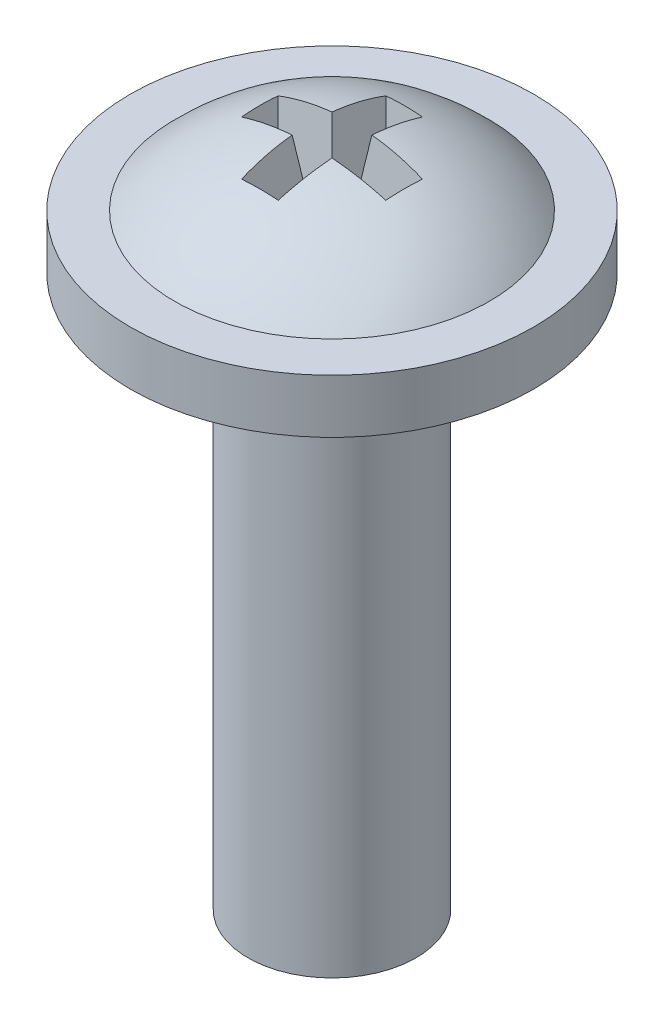
ISO-10303-21;
HEADER;
FILE_DESCRIPTION(('STEP AP214'),'2;1');
FILE_NAME('part.step','',(''),(''),'','','');
FILE_SCHEMA(('AUTOMOTIVE_DESIGN { 1 0 10303 214 1 1 1 1 }'));
ENDSEC;
DATA;
#1=APPLICATION_CONTEXT('core data for automotive mechanical design processes');
#2=APPLICATION_PROTOCOL_DEFINITION('international standard','automotive_design',2000,#1);
#3=PRODUCT_CONTEXT('',#1,'mechanical');
#4=PRODUCT('Part','Part','',(#3));
#5=PRODUCT_RELATED_PRODUCT_CATEGORY('part','',(#4));
#6=PRODUCT_DEFINITION_FORMATION('','',#4);
#7=PRODUCT_DEFINITION_CONTEXT('part definition',#1,'design');
#8=PRODUCT_DEFINITION('design','',#6,#7);
#9=PRODUCT_DEFINITION_SHAPE('','',#8);
#10=(LENGTH_UNIT() NAMED_UNIT(*) SI_UNIT(.MILLI.,.METRE.));
#11=(NAMED_UNIT(*) PLANE_ANGLE_UNIT() SI_UNIT($,.RADIAN.));
#12=(NAMED_UNIT(*) SI_UNIT($,.STERADIAN.) SOLID_ANGLE_UNIT());
#13=UNCERTAINTY_MEASURE_WITH_UNIT(LENGTH_MEASURE(1.E-05),#10,'distance_accuracy_value','');
#14=(GEOMETRIC_REPRESENTATION_CONTEXT(3) GLOBAL_UNCERTAINTY_ASSIGNED_CONTEXT((#13)) GLOBAL_UNIT_ASSIGNED_CONTEXT((#10,
#11,#12)) REPRESENTATION_CONTEXT('',''));
#15=CARTESIAN_POINT('',(0.,0.,0.));
#16=DIRECTION('',(0.,0.,1.));
#17=DIRECTION('',(1.,0.,0.));
#18=AXIS2_PLACEMENT_3D('',#15,#16,#17);
#19=CARTESIAN_POINT('',(0.,8.587994,0.));
#20=DIRECTION('',(0.,-1.,0.));
#21=DIRECTION('',(1.,0.,0.));
#22=AXIS2_PLACEMENT_3D('',#19,#20,#21);
#23=SPHERICAL_SURFACE('',#22,4.112006);
#24=CARTESIAN_POINT('',(0.,11.43,0.));
#25=DIRECTION('',(0.,-1.,0.));
#26=DIRECTION('',(0.,0.,-1.));
#27=AXIS2_PLACEMENT_3D('',#24,#25,#26);
#28=CIRCLE('',#27,2.9718);
#29=CARTESIAN_POINT('',(0.,11.43,-2.9718));
#30=VERTEX_POINT('',#29);
#31=EDGE_CURVE('E144',#30,#30,#28,.T.);
#32=ORIENTED_EDGE('',*,*,#31,.F.);
#33=EDGE_LOOP('',(#32));
#34=FACE_BOUND('',#33,.T.);
#35=CARTESIAN_POINT('',(0.,8.47510737632755,0.803230064141093));
#36=DIRECTION('',(0.,-0.139173100960066,0.99026806874157));
#37=DIRECTION('',(0.,-0.99026806874157,-0.139173100960066));
#38=AXIS2_PLACEMENT_3D('',#35,#36,#37);
#39=CIRCLE('',#38,4.03121215247867);
#40=CARTESIAN_POINT('',(-0.346193686486263,12.4523402106765,1.36219368648626));
#41=VERTEX_POINT('',#40);
#42=CARTESIAN_POINT('',(0.346193686486263,12.4523402106765,1.36219368648626));
#43=VERTEX_POINT('',#42);
#44=EDGE_CURVE('E190',#41,#43,#39,.F.);
#45=ORIENTED_EDGE('',*,*,#44,.F.);
#46=CARTESIAN_POINT('',(0.193090877395566,8.61513115308259,0.));
#47=DIRECTION('',(-0.99026806874157,-0.139173100960066,0.));
#48=DIRECTION('',(0.139173100960066,-0.99026806874157,0.));
#49=AXIS2_PLACEMENT_3D('',#46,#47,#48);
#50=CIRCLE('',#49,4.10738028821598);
#51=CARTESIAN_POINT('',(-0.376143924808765,12.6654472296146,0.376143924808762));
#52=VERTEX_POINT('',#51);
#53=EDGE_CURVE('E11',#41,#52,#50,.T.);
#54=ORIENTED_EDGE('',*,*,#53,.T.);
#55=CARTESIAN_POINT('',(0.,8.61513115308259,-0.19309087739557));
#56=DIRECTION('',(0.,-0.139173100960066,0.99026806874157));
#57=DIRECTION('',(0.,-0.99026806874157,-0.139173100960066));
#58=AXIS2_PLACEMENT_3D('',#55,#56,#57);
#59=CIRCLE('',#58,4.10738028821598);
#60=CARTESIAN_POINT('',(-1.36219368648626,12.4523402106765,0.34619368648626));
#61=VERTEX_POINT('',#60);
#62=EDGE_CURVE('E53',#61,#52,#59,.F.);
#63=ORIENTED_EDGE('',*,*,#62,.F.);
#64=CARTESIAN_POINT('',(-0.803230064141096,8.47510737632755,0.));
#65=DIRECTION('',(-0.99026806874157,-0.139173100960066,0.));
#66=DIRECTION('',(0.139173100960066,-0.99026806874157,0.));
#67=AXIS2_PLACEMENT_3D('',#64,#65,#66);
#68=CIRCLE('',#67,4.03121215247867);
#69=CARTESIAN_POINT('',(-1.36219368648626,12.4523402106765,-0.34619368648626));
#70=VERTEX_POINT('',#69);
#71=EDGE_CURVE('E212',#61,#70,#68,.T.);
#72=ORIENTED_EDGE('',*,*,#71,.T.);
#73=CARTESIAN_POINT('',(0.,8.61513115308259,0.193090877395571));
#74=DIRECTION('',(0.,-0.139173100960066,-0.99026806874157));
#75=DIRECTION('',(0.,0.99026806874157,-0.139173100960066));
#76=AXIS2_PLACEMENT_3D('',#73,#74,#75);
#77=CIRCLE('',#76,4.10738028821598);
#78=CARTESIAN_POINT('',(-0.376143924808767,12.6654472296146,-0.376143924808761));
#79=VERTEX_POINT('',#78);
#80=EDGE_CURVE('E210',#79,#70,#77,.F.);
#81=ORIENTED_EDGE('',*,*,#80,.F.);
#82=CARTESIAN_POINT('',(0.193090877395564,8.61513115308259,0.));
#83=DIRECTION('',(-0.99026806874157,-0.139173100960066,0.));
#84=DIRECTION('',(0.139173100960066,-0.99026806874157,0.));
#85=AXIS2_PLACEMENT_3D('',#82,#83,#84);
#86=CIRCLE('',#85,4.10738028821598);
#87=CARTESIAN_POINT('',(-0.346193686486261,12.4523402106765,-1.36219368648626));
#88=VERTEX_POINT('',#87);
#89=EDGE_CURVE('E207',#79,#88,#86,.T.);
#90=ORIENTED_EDGE('',*,*,#89,.T.);
#91=CARTESIAN_POINT('',(0.,8.47510737632755,-0.803230064141093));
#92=DIRECTION('',(0.,-0.139173100960066,-0.99026806874157));
#93=DIRECTION('',(0.,0.99026806874157,-0.139173100960066));
#94=AXIS2_PLACEMENT_3D('',#91,#92,#93);
#95=CIRCLE('',#94,4.03121215247867);
#96=CARTESIAN_POINT('',(0.346193686486262,12.4523402106765,-1.36219368648626));
#97=VERTEX_POINT('',#96);
#98=EDGE_CURVE('E205',#97,#88,#95,.F.);
#99=ORIENTED_EDGE('',*,*,#98,.F.);
#100=CARTESIAN_POINT('',(-0.193090877395566,8.61513115308259,0.));
#101=DIRECTION('',(0.99026806874157,-0.139173100960066,0.));
#102=DIRECTION('',(0.139173100960066,0.99026806874157,0.));
#103=AXIS2_PLACEMENT_3D('',#100,#101,#102);
#104=CIRCLE('',#103,4.10738028821598);
#105=CARTESIAN_POINT('',(0.376143924808765,12.6654472296146,-0.376143924808762));
#106=VERTEX_POINT('',#105);
#107=EDGE_CURVE('E202',#97,#106,#104,.T.);
#108=ORIENTED_EDGE('',*,*,#107,.T.);
#109=CARTESIAN_POINT('',(0.,8.61513115308259,0.19309087739557));
#110=DIRECTION('',(0.,-0.139173100960066,-0.99026806874157));
#111=DIRECTION('',(0.,0.99026806874157,-0.139173100960066));
#112=AXIS2_PLACEMENT_3D('',#109,#110,#111);
#113=CIRCLE('',#112,4.10738028821598);
#114=CARTESIAN_POINT('',(1.36219368648626,12.4523402106765,-0.34619368648626));
#115=VERTEX_POINT('',#114);
#116=EDGE_CURVE('E200',#115,#106,#113,.F.);
#117=ORIENTED_EDGE('',*,*,#116,.F.);
#118=CARTESIAN_POINT('',(0.803230064141096,8.47510737632755,0.));
#119=DIRECTION('',(0.99026806874157,-0.139173100960066,0.));
#120=DIRECTION('',(0.139173100960066,0.99026806874157,0.));
#121=AXIS2_PLACEMENT_3D('',#118,#119,#120);
#122=CIRCLE('',#121,4.03121215247867);
#123=CARTESIAN_POINT('',(1.36219368648626,12.4523402106765,0.346193686486261));
#124=VERTEX_POINT('',#123);
#125=EDGE_CURVE('E197',#115,#124,#122,.T.);
#126=ORIENTED_EDGE('',*,*,#125,.T.);
#127=CARTESIAN_POINT('',(0.,8.61513115308259,-0.193090877395571));
#128=DIRECTION('',(0.,-0.139173100960066,0.99026806874157));
#129=DIRECTION('',(0.,-0.99026806874157,-0.139173100960066));
#130=AXIS2_PLACEMENT_3D('',#127,#128,#129);
#131=CIRCLE('',#130,4.10738028821598);
#132=CARTESIAN_POINT('',(0.376143924808765,12.6654472296146,0.376143924808762));
#133=VERTEX_POINT('',#132);
#134=EDGE_CURVE('E195',#133,#124,#131,.F.);
#135=ORIENTED_EDGE('',*,*,#134,.F.);
#136=CARTESIAN_POINT('',(-0.193090877395567,8.61513115308259,0.));
#137=DIRECTION('',(0.99026806874157,-0.139173100960066,0.));
#138=DIRECTION('',(0.139173100960066,0.99026806874157,0.));
#139=AXIS2_PLACEMENT_3D('',#136,#137,#138);
#140=CIRCLE('',#139,4.10738028821598);
#141=EDGE_CURVE('E192',#133,#43,#140,.T.);
#142=ORIENTED_EDGE('',*,*,#141,.T.);
#143=EDGE_LOOP('',(#45,#54,#63,#72,#81,#90,#99,#108,#117,#126,#135,#142));
#144=FACE_BOUND('',#143,.T.);
#145=ADVANCED_FACE('F45',(#34,#144),#23,.T.);
#146=CARTESIAN_POINT('',(0.,0.,0.));
#147=DIRECTION('',(0.,-1.,0.));
#148=DIRECTION('',(0.,0.,-1.));
#149=AXIS2_PLACEMENT_3D('',#146,#147,#148);
#150=PLANE('',#149);
#151=CARTESIAN_POINT('',(0.,0.,0.));
#152=DIRECTION('',(0.,-1.,0.));
#153=DIRECTION('',(0.,0.,-1.));
#154=AXIS2_PLACEMENT_3D('',#151,#152,#153);
#155=CIRCLE('',#154,1.5875);
#156=CARTESIAN_POINT('',(0.,0.,-1.5875));
#157=VERTEX_POINT('',#156);
#158=EDGE_CURVE('E187',#157,#157,#155,.T.);
#159=ORIENTED_EDGE('',*,*,#158,.T.);
#160=EDGE_LOOP('',(#159));
#161=FACE_BOUND('',#160,.T.);
#162=ADVANCED_FACE('F47',(#161),#150,.T.);
#163=CARTESIAN_POINT('',(0.,0.,0.));
#164=DIRECTION('',(0.,-1.,0.));
#165=DIRECTION('',(0.,0.,-1.));
#166=AXIS2_PLACEMENT_3D('',#163,#164,#165);
#167=CYLINDRICAL_SURFACE('',#166,1.5875);
#168=CARTESIAN_POINT('',(0.,10.414,0.));
#169=DIRECTION('',(0.,-1.,0.));
#170=DIRECTION('',(0.,0.,-1.));
#171=AXIS2_PLACEMENT_3D('',#168,#169,#170);
#172=CIRCLE('',#171,1.5875);
#173=CARTESIAN_POINT('',(0.,10.414,-1.5875));
#174=VERTEX_POINT('',#173);
#175=EDGE_CURVE('E184',#174,#174,#172,.T.);
#176=ORIENTED_EDGE('',*,*,#175,.T.);
#177=EDGE_LOOP('',(#176));
#178=FACE_BOUND('',#177,.T.);
#179=ORIENTED_EDGE('',*,*,#158,.F.);
#180=EDGE_LOOP('',(#179));
#181=FACE_BOUND('',#180,.T.);
#182=ADVANCED_FACE('F293',(#178,#181),#167,.T.);
#183=CARTESIAN_POINT('',(1.5875,10.414,0.));
#184=DIRECTION('',(0.,-1.,0.));
#185=DIRECTION('',(0.,0.,-1.));
#186=AXIS2_PLACEMENT_3D('',#183,#184,#185);
#187=PLANE('',#186);
#188=CARTESIAN_POINT('',(0.,10.414,0.));
#189=DIRECTION('',(0.,-1.,0.));
#190=DIRECTION('',(0.,0.,-1.));
#191=AXIS2_PLACEMENT_3D('',#188,#189,#190);
#192=CIRCLE('',#191,3.81);
#193=CARTESIAN_POINT('',(0.,10.414,-3.81));
#194=VERTEX_POINT('',#193);
#195=EDGE_CURVE('E181',#194,#194,#192,.T.);
#196=ORIENTED_EDGE('',*,*,#195,.T.);
#197=EDGE_LOOP('',(#196));
#198=FACE_BOUND('',#197,.T.);
#199=ORIENTED_EDGE('',*,*,#175,.F.);
#200=EDGE_LOOP('',(#199));
#201=FACE_BOUND('',#200,.T.);
#202=ADVANCED_FACE('F305',(#198,#201),#187,.T.);
#203=CARTESIAN_POINT('',(0.,0.,0.));
#204=DIRECTION('',(0.,-1.,0.));
#205=DIRECTION('',(0.,0.,-1.));
#206=AXIS2_PLACEMENT_3D('',#203,#204,#205);
#207=CYLINDRICAL_SURFACE('',#206,3.81);
#208=CARTESIAN_POINT('',(0.,11.43,0.));
#209=DIRECTION('',(0.,-1.,0.));
#210=DIRECTION('',(0.,0.,-1.));
#211=AXIS2_PLACEMENT_3D('',#208,#209,#210);
#212=CIRCLE('',#211,3.81);
#213=CARTESIAN_POINT('',(0.,11.43,-3.81));
#214=VERTEX_POINT('',#213);
#215=EDGE_CURVE('E178',#214,#214,#212,.T.);
#216=ORIENTED_EDGE('',*,*,#215,.T.);
#217=EDGE_LOOP('',(#216));
#218=FACE_BOUND('',#217,.T.);
#219=ORIENTED_EDGE('',*,*,#195,.F.);
#220=EDGE_LOOP('',(#219));
#221=FACE_BOUND('',#220,.T.);
#222=ADVANCED_FACE('F301',(#218,#221),#207,.T.);
#223=CARTESIAN_POINT('',(3.81,11.43,0.));
#224=DIRECTION('',(0.,1.,0.));
#225=DIRECTION('',(0.,0.,1.));
#226=AXIS2_PLACEMENT_3D('',#223,#224,#225);
#227=PLANE('',#226);
#228=ORIENTED_EDGE('',*,*,#31,.T.);
#229=EDGE_LOOP('',(#228));
#230=FACE_BOUND('',#229,.T.);
#231=ORIENTED_EDGE('',*,*,#215,.F.);
#232=EDGE_LOOP('',(#231));
#233=FACE_BOUND('',#232,.T.);
#234=ADVANCED_FACE('F298',(#230,#233),#227,.T.);
#235=CARTESIAN_POINT('',(-0.381000000000002,12.7,1.397));
#236=DIRECTION('',(-0.99026806874157,-0.139173100960066,0.));
#237=DIRECTION('',(0.139173100960066,-0.99026806874157,0.));
#238=AXIS2_PLACEMENT_3D('',#235,#236,#237);
#239=PLANE('',#238);
#240=DIRECTION('',(0.137844537491629,-0.980814848463989,-0.137844537491629));
#241=VECTOR('',#240,1.);
#242=CARTESIAN_POINT('',(-0.381000000000002,12.7,1.397));
#243=LINE('',#242,#241);
#244=CARTESIAN_POINT('',(-0.0954210238847424,10.668,1.11142102388474));
#245=VERTEX_POINT('',#244);
#246=EDGE_CURVE('E60',#245,#41,#243,.F.);
#247=ORIENTED_EDGE('',*,*,#246,.F.);
#248=DIRECTION('',(0.,0.,1.));
#249=VECTOR('',#248,1.);
#250=CARTESIAN_POINT('',(-0.0954210238847421,10.668,1.397));
#251=LINE('',#250,#249);
#252=CARTESIAN_POINT('',(-0.0954210238847434,10.668,0.0954210238847397));
#253=VERTEX_POINT('',#252);
#254=EDGE_CURVE('E134',#245,#253,#251,.F.);
#255=ORIENTED_EDGE('',*,*,#254,.T.);
#256=DIRECTION('',(0.137844537491629,-0.980814848463989,-0.137844537491629));
#257=VECTOR('',#256,1.);
#258=CARTESIAN_POINT('',(-0.400305134380545,12.8373631686579,0.400305134380541));
#259=LINE('',#258,#257);
#260=EDGE_CURVE('E136',#253,#52,#259,.F.);
#261=ORIENTED_EDGE('',*,*,#260,.T.);
#262=ORIENTED_EDGE('',*,*,#53,.F.);
#263=EDGE_LOOP('',(#247,#255,#261,#262));
#264=FACE_BOUND('',#263,.T.);
#265=ADVANCED_FACE('F135',(#264),#239,.F.);
#266=CARTESIAN_POINT('',(-1.397,12.7,0.381));
#267=DIRECTION('',(0.,-0.139173100960066,0.99026806874157));
#268=DIRECTION('',(0.,-0.99026806874157,-0.139173100960066));
#269=AXIS2_PLACEMENT_3D('',#266,#267,#268);
#270=PLANE('',#269);
#271=ORIENTED_EDGE('',*,*,#62,.T.);
#272=ORIENTED_EDGE('',*,*,#260,.F.);
#273=DIRECTION('',(1.,0.,0.));
#274=VECTOR('',#273,1.);
#275=CARTESIAN_POINT('',(-1.397,10.668,0.0954210238847399));
#276=LINE('',#275,#274);
#277=CARTESIAN_POINT('',(-1.11142102388474,10.668,0.0954210238847399));
#278=VERTEX_POINT('',#277);
#279=EDGE_CURVE('E140',#278,#253,#276,.T.);
#280=ORIENTED_EDGE('',*,*,#279,.F.);
#281=DIRECTION('',(0.137844537491629,-0.980814848463989,-0.137844537491629));
#282=VECTOR('',#281,1.);
#283=CARTESIAN_POINT('',(-1.397,12.7,0.381));
#284=LINE('',#283,#282);
#285=EDGE_CURVE('E145',#278,#61,#284,.F.);
#286=ORIENTED_EDGE('',*,*,#285,.T.);
#287=EDGE_LOOP('',(#271,#272,#280,#286));
#288=FACE_BOUND('',#287,.T.);
#289=ADVANCED_FACE('F143',(#288),#270,.F.);
#290=CARTESIAN_POINT('',(-1.397,12.7,0.381));
#291=DIRECTION('',(-0.99026806874157,-0.139173100960066,0.));
#292=DIRECTION('',(0.139173100960066,-0.99026806874157,0.));
#293=AXIS2_PLACEMENT_3D('',#290,#291,#292);
#294=PLANE('',#293);
#295=ORIENTED_EDGE('',*,*,#285,.F.);
#296=DIRECTION('',(0.,0.,1.));
#297=VECTOR('',#296,1.);
#298=CARTESIAN_POINT('',(-1.11142102388474,10.668,0.381));
#299=LINE('',#298,#297);
#300=CARTESIAN_POINT('',(-1.11142102388474,10.668,-0.0954210238847392));
#301=VERTEX_POINT('',#300);
#302=EDGE_CURVE('E150',#278,#301,#299,.F.);
#303=ORIENTED_EDGE('',*,*,#302,.T.);
#304=DIRECTION('',(0.137844537491629,-0.980814848463989,0.137844537491629));
#305=VECTOR('',#304,1.);
#306=CARTESIAN_POINT('',(-1.38252114921459,12.5969776235066,-0.366521149214593));
#307=LINE('',#306,#305);
#308=EDGE_CURVE('E221',#301,#70,#307,.F.);
#309=ORIENTED_EDGE('',*,*,#308,.T.);
#310=ORIENTED_EDGE('',*,*,#71,.F.);
#311=EDGE_LOOP('',(#295,#303,#309,#310));
#312=FACE_BOUND('',#311,.T.);
#313=ADVANCED_FACE('F219',(#312),#294,.F.);
#314=CARTESIAN_POINT('',(-0.381000000000004,12.7,-0.380999999999999));
#315=DIRECTION('',(0.,-0.139173100960066,-0.99026806874157));
#316=DIRECTION('',(0.,0.99026806874157,-0.139173100960066));
#317=AXIS2_PLACEMENT_3D('',#314,#315,#316);
#318=PLANE('',#317);
#319=ORIENTED_EDGE('',*,*,#80,.T.);
#320=ORIENTED_EDGE('',*,*,#308,.F.);
#321=DIRECTION('',(-1.,0.,0.));
#322=VECTOR('',#321,1.);
#323=CARTESIAN_POINT('',(-0.381000000000004,10.668,-0.0954210238847391));
#324=LINE('',#323,#322);
#325=CARTESIAN_POINT('',(-0.095421023884745,10.668,-0.095421023884739));
#326=VERTEX_POINT('',#325);
#327=EDGE_CURVE('E152',#326,#301,#324,.T.);
#328=ORIENTED_EDGE('',*,*,#327,.F.);
#329=DIRECTION('',(0.137844537491628,-0.980814848463989,0.137844537491629));
#330=VECTOR('',#329,1.);
#331=CARTESIAN_POINT('',(-0.381000000000004,12.7,-0.380999999999999));
#332=LINE('',#331,#330);
#333=EDGE_CURVE('E222',#326,#79,#332,.F.);
#334=ORIENTED_EDGE('',*,*,#333,.T.);
#335=EDGE_LOOP('',(#319,#320,#328,#334));
#336=FACE_BOUND('',#335,.T.);
#337=ADVANCED_FACE('F278',(#336),#318,.F.);
#338=CARTESIAN_POINT('',(-0.381000000000004,12.7,-0.380999999999999));
#339=DIRECTION('',(-0.99026806874157,-0.139173100960066,0.));
#340=DIRECTION('',(0.139173100960066,-0.99026806874157,0.));
#341=AXIS2_PLACEMENT_3D('',#338,#339,#340);
#342=PLANE('',#341);
#343=ORIENTED_EDGE('',*,*,#333,.F.);
#344=DIRECTION('',(0.,0.,1.));
#345=VECTOR('',#344,1.);
#346=CARTESIAN_POINT('',(-0.095421023884744,10.668,-0.380999999999998));
#347=LINE('',#346,#345);
#348=CARTESIAN_POINT('',(-0.0954210238847412,10.668,-1.11142102388474));
#349=VERTEX_POINT('',#348);
#350=EDGE_CURVE('E157',#326,#349,#347,.F.);
#351=ORIENTED_EDGE('',*,*,#350,.T.);
#352=DIRECTION('',(0.137844537491628,-0.980814848463989,0.137844537491629));
#353=VECTOR('',#352,1.);
#354=CARTESIAN_POINT('',(-0.361694865619459,12.5626368313421,-1.37769486561945));
#355=LINE('',#354,#353);
#356=EDGE_CURVE('E227',#349,#88,#355,.F.);
#357=ORIENTED_EDGE('',*,*,#356,.T.);
#358=ORIENTED_EDGE('',*,*,#89,.F.);
#359=EDGE_LOOP('',(#343,#351,#357,#358));
#360=FACE_BOUND('',#359,.T.);
#361=ADVANCED_FACE('F274',(#360),#342,.F.);
#362=CARTESIAN_POINT('',(0.381000000000001,12.7,-1.397));
#363=DIRECTION('',(0.,-0.139173100960066,-0.99026806874157));
#364=DIRECTION('',(0.,0.99026806874157,-0.139173100960066));
#365=AXIS2_PLACEMENT_3D('',#362,#363,#364);
#366=PLANE('',#365);
#367=ORIENTED_EDGE('',*,*,#98,.T.);
#368=ORIENTED_EDGE('',*,*,#356,.F.);
#369=DIRECTION('',(-1.,0.,0.));
#370=VECTOR('',#369,1.);
#371=CARTESIAN_POINT('',(0.381000000000001,10.668,-1.11142102388474));
#372=LINE('',#371,#370);
#373=CARTESIAN_POINT('',(0.0954210238847415,10.668,-1.11142102388474));
#374=VERTEX_POINT('',#373);
#375=EDGE_CURVE('E159',#374,#349,#372,.T.);
#376=ORIENTED_EDGE('',*,*,#375,.F.);
#377=DIRECTION('',(-0.137844537491629,-0.980814848463989,0.137844537491629));
#378=VECTOR('',#377,1.);
#379=CARTESIAN_POINT('',(0.381000000000001,12.7,-1.397));
#380=LINE('',#379,#378);
#381=EDGE_CURVE('E230',#374,#97,#380,.F.);
#382=ORIENTED_EDGE('',*,*,#381,.T.);
#383=EDGE_LOOP('',(#367,#368,#376,#382));
#384=FACE_BOUND('',#383,.T.);
#385=ADVANCED_FACE('F271',(#384),#366,.F.);
#386=CARTESIAN_POINT('',(0.381000000000001,12.7,-1.397));
#387=DIRECTION('',(0.99026806874157,-0.139173100960066,0.));
#388=DIRECTION('',(0.139173100960066,0.99026806874157,0.));
#389=AXIS2_PLACEMENT_3D('',#386,#387,#388);
#390=PLANE('',#389);
#391=ORIENTED_EDGE('',*,*,#381,.F.);
#392=DIRECTION('',(0.,0.,-1.));
#393=VECTOR('',#392,1.);
#394=CARTESIAN_POINT('',(0.095421023884741,10.668,-1.397));
#395=LINE('',#394,#393);
#396=CARTESIAN_POINT('',(0.0954210238847431,10.668,-0.0954210238847393));
#397=VERTEX_POINT('',#396);
#398=EDGE_CURVE('E162',#374,#397,#395,.F.);
#399=ORIENTED_EDGE('',*,*,#398,.T.);
#400=DIRECTION('',(-0.137844537491629,-0.980814848463989,0.137844537491629));
#401=VECTOR('',#400,1.);
#402=CARTESIAN_POINT('',(0.400305134380544,12.8373631686579,-0.400305134380541));
#403=LINE('',#402,#401);
#404=EDGE_CURVE('E233',#397,#106,#403,.F.);
#405=ORIENTED_EDGE('',*,*,#404,.T.);
#406=ORIENTED_EDGE('',*,*,#107,.F.);
#407=EDGE_LOOP('',(#391,#399,#405,#406));
#408=FACE_BOUND('',#407,.T.);
#409=ADVANCED_FACE('F267',(#408),#390,.F.);
#410=CARTESIAN_POINT('',(1.397,12.7,-0.380999999999999));
#411=DIRECTION('',(0.,-0.139173100960066,-0.99026806874157));
#412=DIRECTION('',(0.,0.99026806874157,-0.139173100960066));
#413=AXIS2_PLACEMENT_3D('',#410,#411,#412);
#414=PLANE('',#413);
#415=ORIENTED_EDGE('',*,*,#116,.T.);
#416=ORIENTED_EDGE('',*,*,#404,.F.);
#417=DIRECTION('',(-1.,0.,0.));
#418=VECTOR('',#417,1.);
#419=CARTESIAN_POINT('',(1.397,10.668,-0.0954210238847393));
#420=LINE('',#419,#418);
#421=CARTESIAN_POINT('',(1.11142102388474,10.668,-0.0954210238847393));
#422=VERTEX_POINT('',#421);
#423=EDGE_CURVE('E164',#422,#397,#420,.T.);
#424=ORIENTED_EDGE('',*,*,#423,.F.);
#425=DIRECTION('',(-0.137844537491629,-0.980814848463989,0.137844537491629));
#426=VECTOR('',#425,1.);
#427=CARTESIAN_POINT('',(1.397,12.7,-0.380999999999999));
#428=LINE('',#427,#426);
#429=EDGE_CURVE('E236',#422,#115,#428,.F.);
#430=ORIENTED_EDGE('',*,*,#429,.T.);
#431=EDGE_LOOP('',(#415,#416,#424,#430));
#432=FACE_BOUND('',#431,.T.);
#433=ADVANCED_FACE('F265',(#432),#414,.F.);
#434=CARTESIAN_POINT('',(1.397,12.7,-0.380999999999999));
#435=DIRECTION('',(0.99026806874157,-0.139173100960066,0.));
#436=DIRECTION('',(0.139173100960066,0.99026806874157,0.));
#437=AXIS2_PLACEMENT_3D('',#434,#435,#436);
#438=PLANE('',#437);
#439=ORIENTED_EDGE('',*,*,#429,.F.);
#440=DIRECTION('',(0.,0.,-1.));
#441=VECTOR('',#440,1.);
#442=CARTESIAN_POINT('',(1.11142102388474,10.668,-0.380999999999999));
#443=LINE('',#442,#441);
#444=CARTESIAN_POINT('',(1.11142102388474,10.668,0.0954210238847406));
#445=VERTEX_POINT('',#444);
#446=EDGE_CURVE('E167',#422,#445,#443,.F.);
#447=ORIENTED_EDGE('',*,*,#446,.T.);
#448=DIRECTION('',(-0.137844537491629,-0.980814848463989,-0.137844537491629));
#449=VECTOR('',#448,1.);
#450=CARTESIAN_POINT('',(1.38252114921459,12.5969776235066,0.366521149214595));
#451=LINE('',#450,#449);
#452=EDGE_CURVE('E239',#445,#124,#451,.F.);
#453=ORIENTED_EDGE('',*,*,#452,.T.);
#454=ORIENTED_EDGE('',*,*,#125,.F.);
#455=EDGE_LOOP('',(#439,#447,#453,#454));
#456=FACE_BOUND('',#455,.T.);
#457=ADVANCED_FACE('F259',(#456),#438,.F.);
#458=CARTESIAN_POINT('',(0.381000000000003,12.7,0.380999999999999));
#459=DIRECTION('',(0.,-0.139173100960066,0.99026806874157));
#460=DIRECTION('',(0.,-0.99026806874157,-0.139173100960066));
#461=AXIS2_PLACEMENT_3D('',#458,#459,#460);
#462=PLANE('',#461);
#463=ORIENTED_EDGE('',*,*,#134,.T.);
#464=ORIENTED_EDGE('',*,*,#452,.F.);
#465=DIRECTION('',(1.,0.,0.));
#466=VECTOR('',#465,1.);
#467=CARTESIAN_POINT('',(0.381000000000003,10.668,0.0954210238847395));
#468=LINE('',#467,#466);
#469=CARTESIAN_POINT('',(0.0954210238847429,10.668,0.0954210238847391));
#470=VERTEX_POINT('',#469);
#471=EDGE_CURVE('E169',#470,#445,#468,.T.);
#472=ORIENTED_EDGE('',*,*,#471,.F.);
#473=DIRECTION('',(-0.137844537491629,-0.980814848463989,-0.137844537491629));
#474=VECTOR('',#473,1.);
#475=CARTESIAN_POINT('',(0.381000000000003,12.7,0.380999999999999));
#476=LINE('',#475,#474);
#477=EDGE_CURVE('E242',#470,#133,#476,.F.);
#478=ORIENTED_EDGE('',*,*,#477,.T.);
#479=EDGE_LOOP('',(#463,#464,#472,#478));
#480=FACE_BOUND('',#479,.T.);
#481=ADVANCED_FACE('F256',(#480),#462,.F.);
#482=CARTESIAN_POINT('',(0.381000000000003,12.7,0.380999999999999));
#483=DIRECTION('',(0.99026806874157,-0.139173100960066,0.));
#484=DIRECTION('',(0.139173100960066,0.99026806874157,0.));
#485=AXIS2_PLACEMENT_3D('',#482,#483,#484);
#486=PLANE('',#485);
#487=ORIENTED_EDGE('',*,*,#477,.F.);
#488=DIRECTION('',(0.,0.,-1.));
#489=VECTOR('',#488,1.);
#490=CARTESIAN_POINT('',(0.0954210238847428,10.668,0.380999999999999));
#491=LINE('',#490,#489);
#492=CARTESIAN_POINT('',(0.0954210238847423,10.668,1.11142102388474));
#493=VERTEX_POINT('',#492);
#494=EDGE_CURVE('E172',#470,#493,#491,.F.);
#495=ORIENTED_EDGE('',*,*,#494,.T.);
#496=DIRECTION('',(-0.137844537491629,-0.980814848463989,-0.137844537491629));
#497=VECTOR('',#496,1.);
#498=CARTESIAN_POINT('',(0.361694865619461,12.5626368313421,1.37769486561945));
#499=LINE('',#498,#497);
#500=EDGE_CURVE('E245',#493,#43,#499,.F.);
#501=ORIENTED_EDGE('',*,*,#500,.T.);
#502=ORIENTED_EDGE('',*,*,#141,.F.);
#503=EDGE_LOOP('',(#487,#495,#501,#502));
#504=FACE_BOUND('',#503,.T.);
#505=ADVANCED_FACE('F250',(#504),#486,.F.);
#506=CARTESIAN_POINT('',(-0.381000000000002,12.7,1.397));
#507=DIRECTION('',(0.,-0.139173100960066,0.99026806874157));
#508=DIRECTION('',(0.,-0.99026806874157,-0.139173100960066));
#509=AXIS2_PLACEMENT_3D('',#506,#507,#508);
#510=PLANE('',#509);
#511=ORIENTED_EDGE('',*,*,#44,.T.);
#512=ORIENTED_EDGE('',*,*,#500,.F.);
#513=DIRECTION('',(1.,0.,0.));
#514=VECTOR('',#513,1.);
#515=CARTESIAN_POINT('',(-0.381000000000002,10.668,1.11142102388474));
#516=LINE('',#515,#514);
#517=EDGE_CURVE('E174',#245,#493,#516,.T.);
#518=ORIENTED_EDGE('',*,*,#517,.F.);
#519=ORIENTED_EDGE('',*,*,#246,.T.);
#520=EDGE_LOOP('',(#511,#512,#518,#519));
#521=FACE_BOUND('',#520,.T.);
#522=ADVANCED_FACE('F413',(#521),#510,.F.);
#523=CARTESIAN_POINT('',(-0.381000000000003,10.668,0.381));
#524=DIRECTION('',(0.,-1.,0.));
#525=DIRECTION('',(0.,0.,-1.));
#526=AXIS2_PLACEMENT_3D('',#523,#524,#525);
#527=PLANE('',#526);
#528=ORIENTED_EDGE('',*,*,#254,.F.);
#529=ORIENTED_EDGE('',*,*,#517,.T.);
#530=ORIENTED_EDGE('',*,*,#494,.F.);
#531=ORIENTED_EDGE('',*,*,#471,.T.);
#532=ORIENTED_EDGE('',*,*,#446,.F.);
#533=ORIENTED_EDGE('',*,*,#423,.T.);
#534=ORIENTED_EDGE('',*,*,#398,.F.);
#535=ORIENTED_EDGE('',*,*,#375,.T.);
#536=ORIENTED_EDGE('',*,*,#350,.F.);
#537=ORIENTED_EDGE('',*,*,#327,.T.);
#538=ORIENTED_EDGE('',*,*,#302,.F.);
#539=ORIENTED_EDGE('',*,*,#279,.T.);
#540=EDGE_LOOP('',(#528,#529,#530,#531,#532,#533,#534,#535,#536,#537,#538,#539));
#541=FACE_BOUND('',#540,.T.);
#542=ADVANCED_FACE('F148',(#541),#527,.F.);
#543=CLOSED_SHELL('',(#145,#162,#182,#202,#222,#234,#265,#289,#313,#337,#361,#385,#409,#433,
#457,#481,#505,#522,#542));
#544=MANIFOLD_SOLID_BREP('B2',#543);
#545=ADVANCED_BREP_SHAPE_REPRESENTATION('',(#18,#544),#14);
#546=SHAPE_DEFINITION_REPRESENTATION(#9,#545);
ENDSEC;
END-ISO-10303-21;
